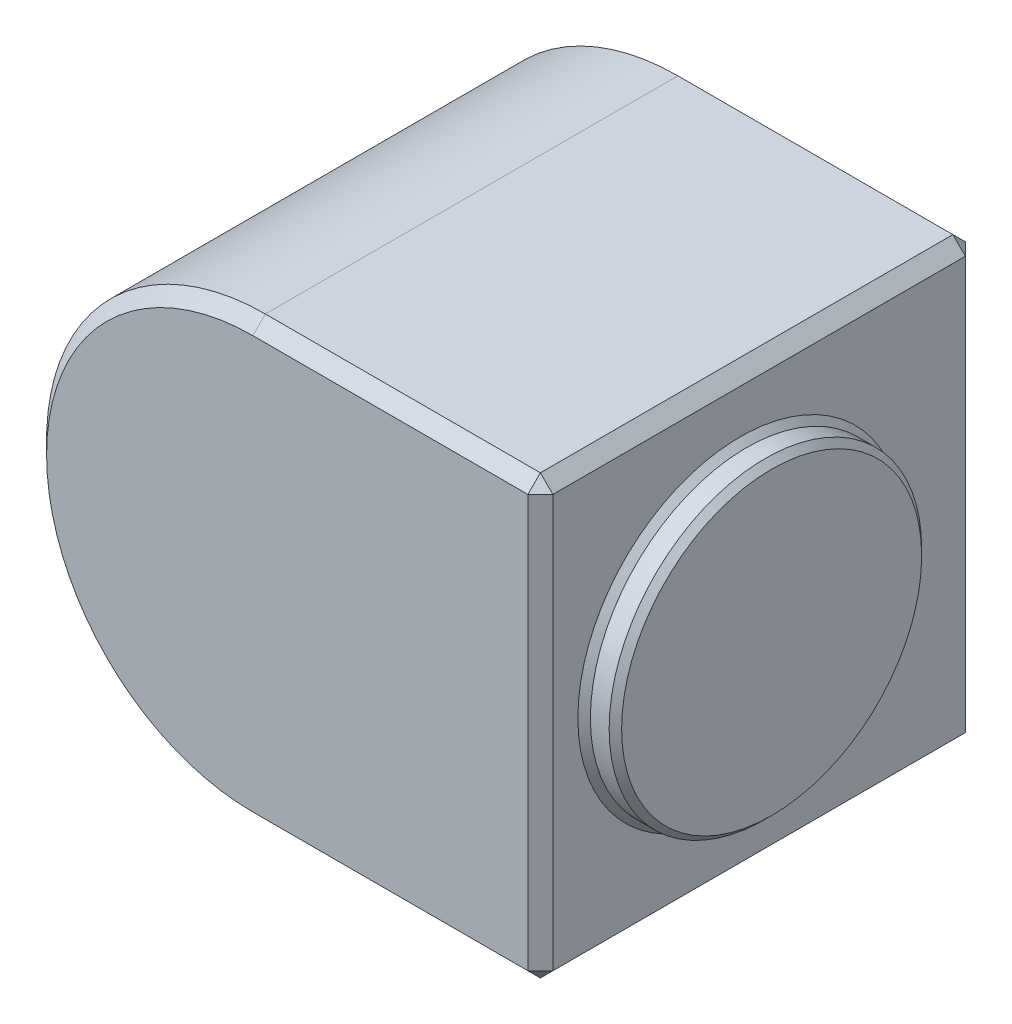
ISO-10303-21;
HEADER;
FILE_DESCRIPTION(('STEP AP214'),'2;1');
FILE_NAME('part.step','',(''),(''),'','','');
FILE_SCHEMA(('AUTOMOTIVE_DESIGN { 1 0 10303 214 1 1 1 1 }'));
ENDSEC;
DATA;
#1=APPLICATION_CONTEXT('core data for automotive mechanical design processes');
#2=APPLICATION_PROTOCOL_DEFINITION('international standard','automotive_design',2000,#1);
#3=PRODUCT_CONTEXT('',#1,'mechanical');
#4=PRODUCT('Part','Part','',(#3));
#5=PRODUCT_RELATED_PRODUCT_CATEGORY('part','',(#4));
#6=PRODUCT_DEFINITION_FORMATION('','',#4);
#7=PRODUCT_DEFINITION_CONTEXT('part definition',#1,'design');
#8=PRODUCT_DEFINITION('design','',#6,#7);
#9=PRODUCT_DEFINITION_SHAPE('','',#8);
#10=(LENGTH_UNIT() NAMED_UNIT(*) SI_UNIT(.MILLI.,.METRE.));
#11=(NAMED_UNIT(*) PLANE_ANGLE_UNIT() SI_UNIT($,.RADIAN.));
#12=(NAMED_UNIT(*) SI_UNIT($,.STERADIAN.) SOLID_ANGLE_UNIT());
#13=UNCERTAINTY_MEASURE_WITH_UNIT(LENGTH_MEASURE(1.E-05),#10,'distance_accuracy_value','');
#14=(GEOMETRIC_REPRESENTATION_CONTEXT(3) GLOBAL_UNCERTAINTY_ASSIGNED_CONTEXT((#13)) GLOBAL_UNIT_ASSIGNED_CONTEXT((#10,
#11,#12)) REPRESENTATION_CONTEXT('',''));
#15=CARTESIAN_POINT('',(0.,0.,0.));
#16=DIRECTION('',(0.,0.,1.));
#17=DIRECTION('',(1.,0.,0.));
#18=AXIS2_PLACEMENT_3D('',#15,#16,#17);
#19=CARTESIAN_POINT('',(0.,0.,70.));
#20=DIRECTION('',(0.,0.,-1.));
#21=DIRECTION('',(-1.,0.,0.));
#22=AXIS2_PLACEMENT_3D('',#19,#20,#21);
#23=CYLINDRICAL_SURFACE('',#22,35.);
#24=DIRECTION('',(0.,0.,-1.));
#25=VECTOR('',#24,1.);
#26=CARTESIAN_POINT('',(0.,35.,70.));
#27=LINE('',#26,#25);
#28=CARTESIAN_POINT('',(0.,35.,68.));
#29=VERTEX_POINT('',#28);
#30=CARTESIAN_POINT('',(0.,35.,2.));
#31=VERTEX_POINT('',#30);
#32=EDGE_CURVE('E129',#29,#31,#27,.T.);
#33=ORIENTED_EDGE('',*,*,#32,.T.);
#34=CARTESIAN_POINT('',(0.,0.,2.));
#35=DIRECTION('',(0.,0.,1.));
#36=DIRECTION('',(1.,0.,0.));
#37=AXIS2_PLACEMENT_3D('',#34,#35,#36);
#38=CIRCLE('',#37,35.);
#39=CARTESIAN_POINT('',(0.,-35.,2.));
#40=VERTEX_POINT('',#39);
#41=EDGE_CURVE('E128',#31,#40,#38,.T.);
#42=ORIENTED_EDGE('',*,*,#41,.T.);
#43=DIRECTION('',(0.,0.,-1.));
#44=VECTOR('',#43,1.);
#45=CARTESIAN_POINT('',(0.,-35.,70.));
#46=LINE('',#45,#44);
#47=CARTESIAN_POINT('',(0.,-35.,68.));
#48=VERTEX_POINT('',#47);
#49=EDGE_CURVE('E113',#48,#40,#46,.T.);
#50=ORIENTED_EDGE('',*,*,#49,.F.);
#51=CARTESIAN_POINT('',(0.,0.,68.));
#52=DIRECTION('',(0.,0.,1.));
#53=DIRECTION('',(1.,0.,0.));
#54=AXIS2_PLACEMENT_3D('',#51,#52,#53);
#55=CIRCLE('',#54,35.);
#56=EDGE_CURVE('E126',#48,#29,#55,.F.);
#57=ORIENTED_EDGE('',*,*,#56,.T.);
#58=EDGE_LOOP('',(#33,#42,#50,#57));
#59=FACE_BOUND('',#58,.T.);
#60=ADVANCED_FACE('F32',(#59),#23,.T.);
#61=CARTESIAN_POINT('',(46.,-35.,70.));
#62=DIRECTION('',(0.,1.,0.));
#63=DIRECTION('',(-1.,0.,0.));
#64=AXIS2_PLACEMENT_3D('',#61,#62,#63);
#65=PLANE('',#64);
#66=ORIENTED_EDGE('',*,*,#49,.T.);
#67=DIRECTION('',(1.,0.,0.));
#68=VECTOR('',#67,1.);
#69=CARTESIAN_POINT('',(46.,-35.,2.));
#70=LINE('',#69,#68);
#71=CARTESIAN_POINT('',(44.,-35.,2.));
#72=VERTEX_POINT('',#71);
#73=EDGE_CURVE('E121',#40,#72,#70,.T.);
#74=ORIENTED_EDGE('',*,*,#73,.T.);
#75=DIRECTION('',(0.,0.,1.));
#76=VECTOR('',#75,1.);
#77=CARTESIAN_POINT('',(44.,-35.,70.));
#78=LINE('',#77,#76);
#79=CARTESIAN_POINT('',(44.,-35.,68.));
#80=VERTEX_POINT('',#79);
#81=EDGE_CURVE('E116',#72,#80,#78,.T.);
#82=ORIENTED_EDGE('',*,*,#81,.T.);
#83=DIRECTION('',(-1.,0.,0.));
#84=VECTOR('',#83,1.);
#85=CARTESIAN_POINT('',(0.,-35.,68.));
#86=LINE('',#85,#84);
#87=EDGE_CURVE('E109',#80,#48,#86,.T.);
#88=ORIENTED_EDGE('',*,*,#87,.T.);
#89=EDGE_LOOP('',(#66,#74,#82,#88));
#90=FACE_BOUND('',#89,.T.);
#91=ADVANCED_FACE('F111',(#90),#65,.F.);
#92=CARTESIAN_POINT('',(46.,35.,70.));
#93=DIRECTION('',(-1.,0.,0.));
#94=DIRECTION('',(0.,0.,1.));
#95=AXIS2_PLACEMENT_3D('',#92,#93,#94);
#96=PLANE('',#95);
#97=CARTESIAN_POINT('',(46.,0.,38.));
#98=DIRECTION('',(-1.,0.,0.));
#99=DIRECTION('',(0.,0.,1.));
#100=AXIS2_PLACEMENT_3D('',#97,#98,#99);
#101=CIRCLE('',#100,26.);
#102=CARTESIAN_POINT('',(46.,0.,64.));
#103=VERTEX_POINT('',#102);
#104=EDGE_CURVE('E40',#103,#103,#101,.T.);
#105=ORIENTED_EDGE('',*,*,#104,.T.);
#106=EDGE_LOOP('',(#105));
#107=FACE_BOUND('',#106,.T.);
#108=DIRECTION('',(0.,-1.,0.));
#109=VECTOR('',#108,1.);
#110=CARTESIAN_POINT('',(46.,-35.,68.));
#111=LINE('',#110,#109);
#112=CARTESIAN_POINT('',(46.,33.,68.));
#113=VERTEX_POINT('',#112);
#114=CARTESIAN_POINT('',(46.,-33.,68.));
#115=VERTEX_POINT('',#114);
#116=EDGE_CURVE('E443',#113,#115,#111,.T.);
#117=ORIENTED_EDGE('',*,*,#116,.T.);
#118=DIRECTION('',(0.,0.,-1.));
#119=VECTOR('',#118,1.);
#120=CARTESIAN_POINT('',(46.,-33.,70.));
#121=LINE('',#120,#119);
#122=CARTESIAN_POINT('',(46.,-33.,1.99999999999999));
#123=VERTEX_POINT('',#122);
#124=EDGE_CURVE('E449',#115,#123,#121,.T.);
#125=ORIENTED_EDGE('',*,*,#124,.T.);
#126=DIRECTION('',(0.,1.,0.));
#127=VECTOR('',#126,1.);
#128=CARTESIAN_POINT('',(46.,35.,1.99999999999999));
#129=LINE('',#128,#127);
#130=CARTESIAN_POINT('',(46.,33.,1.99999999999999));
#131=VERTEX_POINT('',#130);
#132=EDGE_CURVE('E447',#123,#131,#129,.T.);
#133=ORIENTED_EDGE('',*,*,#132,.T.);
#134=DIRECTION('',(0.,0.,1.));
#135=VECTOR('',#134,1.);
#136=CARTESIAN_POINT('',(46.,33.,70.));
#137=LINE('',#136,#135);
#138=EDGE_CURVE('E445',#131,#113,#137,.T.);
#139=ORIENTED_EDGE('',*,*,#138,.T.);
#140=EDGE_LOOP('',(#117,#125,#133,#139));
#141=FACE_BOUND('',#140,.T.);
#142=ADVANCED_FACE('F176',(#107,#141),#96,.F.);
#143=CARTESIAN_POINT('',(0.,35.,70.));
#144=DIRECTION('',(0.,-1.,0.));
#145=DIRECTION('',(1.,0.,0.));
#146=AXIS2_PLACEMENT_3D('',#143,#144,#145);
#147=PLANE('',#146);
#148=DIRECTION('',(0.,0.,-1.));
#149=VECTOR('',#148,1.);
#150=CARTESIAN_POINT('',(44.,35.,70.));
#151=LINE('',#150,#149);
#152=CARTESIAN_POINT('',(44.,35.,68.));
#153=VERTEX_POINT('',#152);
#154=CARTESIAN_POINT('',(44.,35.,2.));
#155=VERTEX_POINT('',#154);
#156=EDGE_CURVE('E47',#153,#155,#151,.T.);
#157=ORIENTED_EDGE('',*,*,#156,.T.);
#158=DIRECTION('',(-1.,0.,0.));
#159=VECTOR('',#158,1.);
#160=CARTESIAN_POINT('',(0.,35.,2.));
#161=LINE('',#160,#159);
#162=EDGE_CURVE('E159',#155,#31,#161,.T.);
#163=ORIENTED_EDGE('',*,*,#162,.T.);
#164=ORIENTED_EDGE('',*,*,#32,.F.);
#165=DIRECTION('',(1.,0.,0.));
#166=VECTOR('',#165,1.);
#167=CARTESIAN_POINT('',(46.,35.,68.));
#168=LINE('',#167,#166);
#169=EDGE_CURVE('E52',#29,#153,#168,.T.);
#170=ORIENTED_EDGE('',*,*,#169,.T.);
#171=EDGE_LOOP('',(#157,#163,#164,#170));
#172=FACE_BOUND('',#171,.T.);
#173=ADVANCED_FACE('F405',(#172),#147,.F.);
#174=CARTESIAN_POINT('',(0.,0.,70.));
#175=DIRECTION('',(0.,0.,1.));
#176=DIRECTION('',(1.,0.,0.));
#177=AXIS2_PLACEMENT_3D('',#174,#175,#176);
#178=PLANE('',#177);
#179=CARTESIAN_POINT('',(0.,0.,70.));
#180=DIRECTION('',(0.,0.,1.));
#181=DIRECTION('',(1.,0.,0.));
#182=AXIS2_PLACEMENT_3D('',#179,#180,#181);
#183=CIRCLE('',#182,33.);
#184=CARTESIAN_POINT('',(0.,33.,70.));
#185=VERTEX_POINT('',#184);
#186=CARTESIAN_POINT('',(0.,-33.,70.));
#187=VERTEX_POINT('',#186);
#188=EDGE_CURVE('E433',#185,#187,#183,.T.);
#189=ORIENTED_EDGE('',*,*,#188,.T.);
#190=DIRECTION('',(1.,0.,0.));
#191=VECTOR('',#190,1.);
#192=CARTESIAN_POINT('',(46.,-33.,70.));
#193=LINE('',#192,#191);
#194=CARTESIAN_POINT('',(44.,-33.,70.));
#195=VERTEX_POINT('',#194);
#196=EDGE_CURVE('E140',#187,#195,#193,.T.);
#197=ORIENTED_EDGE('',*,*,#196,.T.);
#198=DIRECTION('',(0.,1.,0.));
#199=VECTOR('',#198,1.);
#200=CARTESIAN_POINT('',(44.,35.,70.));
#201=LINE('',#200,#199);
#202=CARTESIAN_POINT('',(44.,33.,70.));
#203=VERTEX_POINT('',#202);
#204=EDGE_CURVE('E436',#195,#203,#201,.T.);
#205=ORIENTED_EDGE('',*,*,#204,.T.);
#206=DIRECTION('',(-1.,0.,0.));
#207=VECTOR('',#206,1.);
#208=CARTESIAN_POINT('',(0.,33.,70.));
#209=LINE('',#208,#207);
#210=EDGE_CURVE('E435',#203,#185,#209,.T.);
#211=ORIENTED_EDGE('',*,*,#210,.T.);
#212=EDGE_LOOP('',(#189,#197,#205,#211));
#213=FACE_BOUND('',#212,.T.);
#214=ADVANCED_FACE('F198',(#213),#178,.T.);
#215=CARTESIAN_POINT('',(0.,0.,0.));
#216=DIRECTION('',(0.,0.,1.));
#217=DIRECTION('',(1.,0.,0.));
#218=AXIS2_PLACEMENT_3D('',#215,#216,#217);
#219=PLANE('',#218);
#220=CARTESIAN_POINT('',(0.,0.,0.));
#221=DIRECTION('',(0.,0.,1.));
#222=DIRECTION('',(1.,0.,0.));
#223=AXIS2_PLACEMENT_3D('',#220,#221,#222);
#224=CIRCLE('',#223,27.);
#225=CARTESIAN_POINT('',(27.,0.,0.));
#226=VERTEX_POINT('',#225);
#227=EDGE_CURVE('E11',#226,#226,#224,.T.);
#228=ORIENTED_EDGE('',*,*,#227,.T.);
#229=EDGE_LOOP('',(#228));
#230=FACE_BOUND('',#229,.T.);
#231=DIRECTION('',(0.,-1.,0.));
#232=VECTOR('',#231,1.);
#233=CARTESIAN_POINT('',(44.,0.,0.));
#234=LINE('',#233,#232);
#235=CARTESIAN_POINT('',(44.,33.,0.));
#236=VERTEX_POINT('',#235);
#237=CARTESIAN_POINT('',(44.,-33.,0.));
#238=VERTEX_POINT('',#237);
#239=EDGE_CURVE('E496',#236,#238,#234,.T.);
#240=ORIENTED_EDGE('',*,*,#239,.T.);
#241=DIRECTION('',(-1.,0.,0.));
#242=VECTOR('',#241,1.);
#243=CARTESIAN_POINT('',(0.,-33.,0.));
#244=LINE('',#243,#242);
#245=CARTESIAN_POINT('',(0.,-33.,0.));
#246=VERTEX_POINT('',#245);
#247=EDGE_CURVE('E510',#238,#246,#244,.T.);
#248=ORIENTED_EDGE('',*,*,#247,.T.);
#249=CARTESIAN_POINT('',(0.,0.,0.));
#250=DIRECTION('',(0.,0.,1.));
#251=DIRECTION('',(1.,0.,0.));
#252=AXIS2_PLACEMENT_3D('',#249,#250,#251);
#253=CIRCLE('',#252,33.);
#254=CARTESIAN_POINT('',(0.,33.,0.));
#255=VERTEX_POINT('',#254);
#256=EDGE_CURVE('E508',#246,#255,#253,.F.);
#257=ORIENTED_EDGE('',*,*,#256,.T.);
#258=DIRECTION('',(1.,0.,0.));
#259=VECTOR('',#258,1.);
#260=CARTESIAN_POINT('',(0.,33.,0.));
#261=LINE('',#260,#259);
#262=EDGE_CURVE('E505',#255,#236,#261,.T.);
#263=ORIENTED_EDGE('',*,*,#262,.T.);
#264=EDGE_LOOP('',(#240,#248,#257,#263));
#265=FACE_BOUND('',#264,.T.);
#266=ADVANCED_FACE('F188',(#230,#265),#219,.F.);
#267=CARTESIAN_POINT('',(51.,0.,38.));
#268=DIRECTION('',(-1.,0.,0.));
#269=DIRECTION('',(0.,0.,1.));
#270=AXIS2_PLACEMENT_3D('',#267,#268,#269);
#271=CYLINDRICAL_SURFACE('',#270,25.);
#272=CARTESIAN_POINT('',(50.,0.,38.));
#273=DIRECTION('',(1.,0.,0.));
#274=DIRECTION('',(0.,0.,-1.));
#275=AXIS2_PLACEMENT_3D('',#272,#273,#274);
#276=CIRCLE('',#275,25.);
#277=CARTESIAN_POINT('',(50.,0.,13.));
#278=VERTEX_POINT('',#277);
#279=EDGE_CURVE('E171',#278,#278,#276,.F.);
#280=ORIENTED_EDGE('',*,*,#279,.T.);
#281=EDGE_LOOP('',(#280));
#282=FACE_BOUND('',#281,.T.);
#283=CARTESIAN_POINT('',(47.,0.,38.));
#284=DIRECTION('',(-1.,0.,0.));
#285=DIRECTION('',(0.,0.,1.));
#286=AXIS2_PLACEMENT_3D('',#283,#284,#285);
#287=CIRCLE('',#286,25.);
#288=CARTESIAN_POINT('',(47.,0.,63.));
#289=VERTEX_POINT('',#288);
#290=EDGE_CURVE('E168',#289,#289,#287,.F.);
#291=ORIENTED_EDGE('',*,*,#290,.T.);
#292=EDGE_LOOP('',(#291));
#293=FACE_BOUND('',#292,.T.);
#294=ADVANCED_FACE('F185',(#282,#293),#271,.T.);
#295=CARTESIAN_POINT('',(51.,0.,38.));
#296=DIRECTION('',(1.,0.,0.));
#297=DIRECTION('',(0.,0.,-1.));
#298=AXIS2_PLACEMENT_3D('',#295,#296,#297);
#299=PLANE('',#298);
#300=CARTESIAN_POINT('',(51.,0.,38.));
#301=DIRECTION('',(1.,0.,0.));
#302=DIRECTION('',(0.,0.,-1.));
#303=AXIS2_PLACEMENT_3D('',#300,#301,#302);
#304=CIRCLE('',#303,24.);
#305=CARTESIAN_POINT('',(51.,0.,14.));
#306=VERTEX_POINT('',#305);
#307=EDGE_CURVE('E165',#306,#306,#304,.T.);
#308=ORIENTED_EDGE('',*,*,#307,.T.);
#309=EDGE_LOOP('',(#308));
#310=FACE_BOUND('',#309,.T.);
#311=ADVANCED_FACE('F187',(#310),#299,.T.);
#312=CARTESIAN_POINT('',(0.,33.,70.));
#313=DIRECTION('',(0.,0.70710678118655,0.707106781186545));
#314=DIRECTION('',(1.,0.,0.));
#315=AXIS2_PLACEMENT_3D('',#312,#313,#314);
#316=PLANE('',#315);
#317=DIRECTION('',(0.,-0.707106781186545,0.70710678118655));
#318=VECTOR('',#317,1.);
#319=CARTESIAN_POINT('',(44.,34.,69.));
#320=LINE('',#319,#318);
#321=EDGE_CURVE('E144',#153,#203,#320,.T.);
#322=ORIENTED_EDGE('',*,*,#321,.F.);
#323=ORIENTED_EDGE('',*,*,#169,.F.);
#324=DIRECTION('',(0.,0.707106781186545,-0.70710678118655));
#325=VECTOR('',#324,1.);
#326=CARTESIAN_POINT('',(0.,33.,70.));
#327=LINE('',#326,#325);
#328=EDGE_CURVE('E139',#185,#29,#327,.T.);
#329=ORIENTED_EDGE('',*,*,#328,.F.);
#330=ORIENTED_EDGE('',*,*,#210,.F.);
#331=EDGE_LOOP('',(#322,#323,#329,#330));
#332=FACE_BOUND('',#331,.T.);
#333=ADVANCED_FACE('F195',(#332),#316,.T.);
#334=CARTESIAN_POINT('',(0.,0.,70.));
#335=DIRECTION('',(0.,0.,-1.));
#336=DIRECTION('',(-1.,0.,0.));
#337=AXIS2_PLACEMENT_3D('',#334,#335,#336);
#338=CONICAL_SURFACE('',#337,33.,0.785398163397445);
#339=ORIENTED_EDGE('',*,*,#328,.T.);
#340=ORIENTED_EDGE('',*,*,#56,.F.);
#341=DIRECTION('',(0.,-0.707106781186545,-0.70710678118655));
#342=VECTOR('',#341,1.);
#343=CARTESIAN_POINT('',(0.,-33.,70.));
#344=LINE('',#343,#342);
#345=EDGE_CURVE('E136',#187,#48,#344,.T.);
#346=ORIENTED_EDGE('',*,*,#345,.F.);
#347=ORIENTED_EDGE('',*,*,#188,.F.);
#348=EDGE_LOOP('',(#339,#340,#346,#347));
#349=FACE_BOUND('',#348,.T.);
#350=ADVANCED_FACE('F134',(#349),#338,.T.);
#351=CARTESIAN_POINT('',(46.,33.,68.));
#352=DIRECTION('',(0.577350269189626,0.57735026918963,0.577350269189622));
#353=DIRECTION('',(-0.70710678118655,0.707106781186545,0.));
#354=AXIS2_PLACEMENT_3D('',#351,#352,#353);
#355=PLANE('',#354);
#356=DIRECTION('',(0.70710678118655,-0.707106781186545,0.));
#357=VECTOR('',#356,1.);
#358=CARTESIAN_POINT('',(46.,33.,68.));
#359=LINE('',#358,#357);
#360=EDGE_CURVE('E150',#153,#113,#359,.T.);
#361=ORIENTED_EDGE('',*,*,#360,.F.);
#362=ORIENTED_EDGE('',*,*,#321,.T.);
#363=DIRECTION('',(0.707106781186545,0.,-0.70710678118655));
#364=VECTOR('',#363,1.);
#365=CARTESIAN_POINT('',(46.,33.,68.));
#366=LINE('',#365,#364);
#367=EDGE_CURVE('E145',#113,#203,#366,.F.);
#368=ORIENTED_EDGE('',*,*,#367,.F.);
#369=EDGE_LOOP('',(#361,#362,#368));
#370=FACE_BOUND('',#369,.T.);
#371=ADVANCED_FACE('F253',(#370),#355,.T.);
#372=CARTESIAN_POINT('',(0.,-33.,70.));
#373=DIRECTION('',(0.,-0.70710678118655,0.707106781186545));
#374=DIRECTION('',(-1.,0.,0.));
#375=AXIS2_PLACEMENT_3D('',#372,#373,#374);
#376=PLANE('',#375);
#377=ORIENTED_EDGE('',*,*,#345,.T.);
#378=ORIENTED_EDGE('',*,*,#87,.F.);
#379=DIRECTION('',(0.,-0.707106781186545,-0.70710678118655));
#380=VECTOR('',#379,1.);
#381=CARTESIAN_POINT('',(44.,-33.,70.));
#382=LINE('',#381,#380);
#383=EDGE_CURVE('E481',#195,#80,#382,.T.);
#384=ORIENTED_EDGE('',*,*,#383,.F.);
#385=ORIENTED_EDGE('',*,*,#196,.F.);
#386=EDGE_LOOP('',(#377,#378,#384,#385));
#387=FACE_BOUND('',#386,.T.);
#388=ADVANCED_FACE('F142',(#387),#376,.T.);
#389=CARTESIAN_POINT('',(44.,0.,70.));
#390=DIRECTION('',(0.70710678118655,0.,0.707106781186545));
#391=DIRECTION('',(0.,-1.,0.));
#392=AXIS2_PLACEMENT_3D('',#389,#390,#391);
#393=PLANE('',#392);
#394=ORIENTED_EDGE('',*,*,#367,.T.);
#395=ORIENTED_EDGE('',*,*,#204,.F.);
#396=DIRECTION('',(-0.707106781186545,0.,0.70710678118655));
#397=VECTOR('',#396,1.);
#398=CARTESIAN_POINT('',(44.,-33.,70.));
#399=LINE('',#398,#397);
#400=EDGE_CURVE('E479',#115,#195,#399,.T.);
#401=ORIENTED_EDGE('',*,*,#400,.F.);
#402=ORIENTED_EDGE('',*,*,#116,.F.);
#403=EDGE_LOOP('',(#394,#395,#401,#402));
#404=FACE_BOUND('',#403,.T.);
#405=ADVANCED_FACE('F246',(#404),#393,.T.);
#406=CARTESIAN_POINT('',(44.,35.,70.));
#407=DIRECTION('',(-0.707106781186545,-0.70710678118655,0.));
#408=DIRECTION('',(0.,0.,-1.));
#409=AXIS2_PLACEMENT_3D('',#406,#407,#408);
#410=PLANE('',#409);
#411=ORIENTED_EDGE('',*,*,#360,.T.);
#412=ORIENTED_EDGE('',*,*,#138,.F.);
#413=DIRECTION('',(-0.70710678118655,0.707106781186545,0.));
#414=VECTOR('',#413,1.);
#415=CARTESIAN_POINT('',(46.,33.,1.99999999999999));
#416=LINE('',#415,#414);
#417=EDGE_CURVE('E476',#155,#131,#416,.F.);
#418=ORIENTED_EDGE('',*,*,#417,.F.);
#419=ORIENTED_EDGE('',*,*,#156,.F.);
#420=EDGE_LOOP('',(#411,#412,#418,#419));
#421=FACE_BOUND('',#420,.T.);
#422=ADVANCED_FACE('F242',(#421),#410,.F.);
#423=CARTESIAN_POINT('',(44.,-33.,70.));
#424=DIRECTION('',(0.577350269189626,-0.57735026918963,0.577350269189622));
#425=DIRECTION('',(0.70710678118655,0.707106781186545,0.));
#426=AXIS2_PLACEMENT_3D('',#423,#424,#425);
#427=PLANE('',#426);
#428=ORIENTED_EDGE('',*,*,#400,.T.);
#429=ORIENTED_EDGE('',*,*,#383,.T.);
#430=DIRECTION('',(-0.70710678118655,-0.707106781186545,0.));
#431=VECTOR('',#430,1.);
#432=CARTESIAN_POINT('',(45.,-34.,68.));
#433=LINE('',#432,#431);
#434=EDGE_CURVE('E470',#115,#80,#433,.T.);
#435=ORIENTED_EDGE('',*,*,#434,.F.);
#436=EDGE_LOOP('',(#428,#429,#435));
#437=FACE_BOUND('',#436,.T.);
#438=ADVANCED_FACE('F238',(#437),#427,.T.);
#439=CARTESIAN_POINT('',(46.,33.,1.99999999999999));
#440=DIRECTION('',(0.577350269189622,0.57735026918963,-0.577350269189626));
#441=DIRECTION('',(0.,0.707106781186545,0.70710678118655));
#442=AXIS2_PLACEMENT_3D('',#439,#440,#441);
#443=PLANE('',#442);
#444=DIRECTION('',(0.70710678118655,0.,0.707106781186545));
#445=VECTOR('',#444,1.);
#446=CARTESIAN_POINT('',(46.,33.,1.99999999999999));
#447=LINE('',#446,#445);
#448=EDGE_CURVE('E467',#236,#131,#447,.T.);
#449=ORIENTED_EDGE('',*,*,#448,.F.);
#450=DIRECTION('',(0.,-0.707106781186545,-0.70710678118655));
#451=VECTOR('',#450,1.);
#452=CARTESIAN_POINT('',(44.,34.,1.));
#453=LINE('',#452,#451);
#454=EDGE_CURVE('E473',#155,#236,#453,.T.);
#455=ORIENTED_EDGE('',*,*,#454,.F.);
#456=ORIENTED_EDGE('',*,*,#417,.T.);
#457=EDGE_LOOP('',(#449,#455,#456));
#458=FACE_BOUND('',#457,.T.);
#459=ADVANCED_FACE('F234',(#458),#443,.T.);
#460=CARTESIAN_POINT('',(0.,35.,2.));
#461=DIRECTION('',(0.,-0.70710678118655,0.707106781186545));
#462=DIRECTION('',(-1.,0.,0.));
#463=AXIS2_PLACEMENT_3D('',#460,#461,#462);
#464=PLANE('',#463);
#465=ORIENTED_EDGE('',*,*,#454,.T.);
#466=ORIENTED_EDGE('',*,*,#262,.F.);
#467=DIRECTION('',(0.,-0.707106781186545,-0.70710678118655));
#468=VECTOR('',#467,1.);
#469=CARTESIAN_POINT('',(0.,35.,2.));
#470=LINE('',#469,#468);
#471=EDGE_CURVE('E464',#31,#255,#470,.T.);
#472=ORIENTED_EDGE('',*,*,#471,.F.);
#473=ORIENTED_EDGE('',*,*,#162,.F.);
#474=EDGE_LOOP('',(#465,#466,#472,#473));
#475=FACE_BOUND('',#474,.T.);
#476=ADVANCED_FACE('F230',(#475),#464,.F.);
#477=CARTESIAN_POINT('',(46.,-33.,70.));
#478=DIRECTION('',(-0.707106781186545,0.70710678118655,0.));
#479=DIRECTION('',(0.,0.,-1.));
#480=AXIS2_PLACEMENT_3D('',#477,#478,#479);
#481=PLANE('',#480);
#482=ORIENTED_EDGE('',*,*,#434,.T.);
#483=ORIENTED_EDGE('',*,*,#81,.F.);
#484=DIRECTION('',(0.70710678118655,0.707106781186545,0.));
#485=VECTOR('',#484,1.);
#486=CARTESIAN_POINT('',(44.,-35.,2.));
#487=LINE('',#486,#485);
#488=EDGE_CURVE('E461',#123,#72,#487,.F.);
#489=ORIENTED_EDGE('',*,*,#488,.F.);
#490=ORIENTED_EDGE('',*,*,#124,.F.);
#491=EDGE_LOOP('',(#482,#483,#489,#490));
#492=FACE_BOUND('',#491,.T.);
#493=ADVANCED_FACE('F226',(#492),#481,.F.);
#494=CARTESIAN_POINT('',(46.,35.,1.99999999999999));
#495=DIRECTION('',(-0.707106781186545,0.,0.70710678118655));
#496=DIRECTION('',(0.,1.,0.));
#497=AXIS2_PLACEMENT_3D('',#494,#495,#496);
#498=PLANE('',#497);
#499=ORIENTED_EDGE('',*,*,#448,.T.);
#500=ORIENTED_EDGE('',*,*,#132,.F.);
#501=DIRECTION('',(-0.70710678118655,0.,-0.707106781186545));
#502=VECTOR('',#501,1.);
#503=CARTESIAN_POINT('',(45.,-33.,0.999999999999994));
#504=LINE('',#503,#502);
#505=EDGE_CURVE('E459',#238,#123,#504,.F.);
#506=ORIENTED_EDGE('',*,*,#505,.F.);
#507=ORIENTED_EDGE('',*,*,#239,.F.);
#508=EDGE_LOOP('',(#499,#500,#506,#507));
#509=FACE_BOUND('',#508,.T.);
#510=ADVANCED_FACE('F222',(#509),#498,.F.);
#511=CARTESIAN_POINT('',(0.,0.,2.));
#512=DIRECTION('',(0.,0.,1.));
#513=DIRECTION('',(1.,0.,0.));
#514=AXIS2_PLACEMENT_3D('',#511,#512,#513);
#515=CONICAL_SURFACE('',#514,35.,0.785398163397445);
#516=ORIENTED_EDGE('',*,*,#471,.T.);
#517=ORIENTED_EDGE('',*,*,#256,.F.);
#518=DIRECTION('',(0.,0.707106781186545,-0.70710678118655));
#519=VECTOR('',#518,1.);
#520=CARTESIAN_POINT('',(0.,-35.,2.));
#521=LINE('',#520,#519);
#522=EDGE_CURVE('E457',#40,#246,#521,.T.);
#523=ORIENTED_EDGE('',*,*,#522,.F.);
#524=ORIENTED_EDGE('',*,*,#41,.F.);
#525=EDGE_LOOP('',(#516,#517,#523,#524));
#526=FACE_BOUND('',#525,.T.);
#527=ADVANCED_FACE('F218',(#526),#515,.T.);
#528=CARTESIAN_POINT('',(44.,-35.,2.));
#529=DIRECTION('',(0.577350269189622,-0.57735026918963,-0.577350269189626));
#530=DIRECTION('',(0.,0.707106781186545,-0.70710678118655));
#531=AXIS2_PLACEMENT_3D('',#528,#529,#530);
#532=PLANE('',#531);
#533=ORIENTED_EDGE('',*,*,#505,.T.);
#534=ORIENTED_EDGE('',*,*,#488,.T.);
#535=DIRECTION('',(0.,-0.707106781186545,0.70710678118655));
#536=VECTOR('',#535,1.);
#537=CARTESIAN_POINT('',(44.,-35.,2.));
#538=LINE('',#537,#536);
#539=EDGE_CURVE('E455',#238,#72,#538,.T.);
#540=ORIENTED_EDGE('',*,*,#539,.F.);
#541=EDGE_LOOP('',(#533,#534,#540));
#542=FACE_BOUND('',#541,.T.);
#543=ADVANCED_FACE('F214',(#542),#532,.T.);
#544=CARTESIAN_POINT('',(46.,-35.,2.));
#545=DIRECTION('',(0.,0.70710678118655,0.707106781186545));
#546=DIRECTION('',(1.,0.,0.));
#547=AXIS2_PLACEMENT_3D('',#544,#545,#546);
#548=PLANE('',#547);
#549=ORIENTED_EDGE('',*,*,#522,.T.);
#550=ORIENTED_EDGE('',*,*,#247,.F.);
#551=ORIENTED_EDGE('',*,*,#539,.T.);
#552=ORIENTED_EDGE('',*,*,#73,.F.);
#553=EDGE_LOOP('',(#549,#550,#551,#552));
#554=FACE_BOUND('',#553,.T.);
#555=ADVANCED_FACE('F210',(#554),#548,.F.);
#556=CARTESIAN_POINT('',(0.,0.,5.));
#557=DIRECTION('',(0.,0.,-1.));
#558=DIRECTION('',(-1.,0.,0.));
#559=AXIS2_PLACEMENT_3D('',#556,#557,#558);
#560=CYLINDRICAL_SURFACE('',#559,26.);
#561=CARTESIAN_POINT('',(0.,0.,4.));
#562=DIRECTION('',(0.,0.,-1.));
#563=DIRECTION('',(-1.,0.,0.));
#564=AXIS2_PLACEMENT_3D('',#561,#562,#563);
#565=CIRCLE('',#564,26.);
#566=CARTESIAN_POINT('',(-26.,0.,4.));
#567=VERTEX_POINT('',#566);
#568=EDGE_CURVE('E162',#567,#567,#565,.F.);
#569=ORIENTED_EDGE('',*,*,#568,.T.);
#570=EDGE_LOOP('',(#569));
#571=FACE_BOUND('',#570,.T.);
#572=CARTESIAN_POINT('',(0.,0.,1.00000000000001));
#573=DIRECTION('',(0.,0.,1.));
#574=DIRECTION('',(1.,0.,0.));
#575=AXIS2_PLACEMENT_3D('',#572,#573,#574);
#576=CIRCLE('',#575,26.);
#577=CARTESIAN_POINT('',(26.,0.,1.00000000000001));
#578=VERTEX_POINT('',#577);
#579=EDGE_CURVE('E158',#578,#578,#576,.F.);
#580=ORIENTED_EDGE('',*,*,#579,.T.);
#581=EDGE_LOOP('',(#580));
#582=FACE_BOUND('',#581,.T.);
#583=ADVANCED_FACE('F213',(#571,#582),#560,.F.);
#584=CARTESIAN_POINT('',(0.,0.,5.));
#585=DIRECTION('',(0.,0.,-1.));
#586=DIRECTION('',(-1.,0.,0.));
#587=AXIS2_PLACEMENT_3D('',#584,#585,#586);
#588=PLANE('',#587);
#589=CARTESIAN_POINT('',(0.,0.,5.));
#590=DIRECTION('',(0.,0.,-1.));
#591=DIRECTION('',(-1.,0.,0.));
#592=AXIS2_PLACEMENT_3D('',#589,#590,#591);
#593=CIRCLE('',#592,25.);
#594=CARTESIAN_POINT('',(-25.,0.,5.));
#595=VERTEX_POINT('',#594);
#596=EDGE_CURVE('E155',#595,#595,#593,.T.);
#597=ORIENTED_EDGE('',*,*,#596,.T.);
#598=EDGE_LOOP('',(#597));
#599=FACE_BOUND('',#598,.T.);
#600=ADVANCED_FACE('F265',(#599),#588,.T.);
#601=CARTESIAN_POINT('',(0.,0.,5.));
#602=DIRECTION('',(0.,0.,-1.));
#603=DIRECTION('',(-1.,0.,0.));
#604=AXIS2_PLACEMENT_3D('',#601,#602,#603);
#605=CONICAL_SURFACE('',#604,25.,0.78539816339745);
#606=ORIENTED_EDGE('',*,*,#568,.F.);
#607=EDGE_LOOP('',(#606));
#608=FACE_BOUND('',#607,.T.);
#609=ORIENTED_EDGE('',*,*,#596,.F.);
#610=EDGE_LOOP('',(#609));
#611=FACE_BOUND('',#610,.T.);
#612=ADVANCED_FACE('F262',(#608,#611),#605,.F.);
#613=CARTESIAN_POINT('',(51.,0.,38.));
#614=DIRECTION('',(-1.,0.,0.));
#615=DIRECTION('',(0.,0.,1.));
#616=AXIS2_PLACEMENT_3D('',#613,#614,#615);
#617=CONICAL_SURFACE('',#616,24.,0.785398163397459);
#618=ORIENTED_EDGE('',*,*,#279,.F.);
#619=EDGE_LOOP('',(#618));
#620=FACE_BOUND('',#619,.T.);
#621=ORIENTED_EDGE('',*,*,#307,.F.);
#622=EDGE_LOOP('',(#621));
#623=FACE_BOUND('',#622,.T.);
#624=ADVANCED_FACE('F182',(#620,#623),#617,.T.);
#625=CARTESIAN_POINT('',(47.,0.,38.));
#626=DIRECTION('',(-1.,0.,0.));
#627=DIRECTION('',(0.,0.,1.));
#628=AXIS2_PLACEMENT_3D('',#625,#626,#627);
#629=CONICAL_SURFACE('',#628,25.,0.785398163397431);
#630=ORIENTED_EDGE('',*,*,#104,.F.);
#631=EDGE_LOOP('',(#630));
#632=FACE_BOUND('',#631,.T.);
#633=ORIENTED_EDGE('',*,*,#290,.F.);
#634=EDGE_LOOP('',(#633));
#635=FACE_BOUND('',#634,.T.);
#636=ADVANCED_FACE('F179',(#632,#635),#629,.T.);
#637=CARTESIAN_POINT('',(0.,0.,1.00000000000001));
#638=DIRECTION('',(0.,0.,-1.));
#639=DIRECTION('',(-1.,0.,0.));
#640=AXIS2_PLACEMENT_3D('',#637,#638,#639);
#641=CONICAL_SURFACE('',#640,26.,0.785398163397447);
#642=ORIENTED_EDGE('',*,*,#227,.F.);
#643=EDGE_LOOP('',(#642));
#644=FACE_BOUND('',#643,.T.);
#645=ORIENTED_EDGE('',*,*,#579,.F.);
#646=EDGE_LOOP('',(#645));
#647=FACE_BOUND('',#646,.T.);
#648=ADVANCED_FACE('F34',(#644,#647),#641,.F.);
#649=CLOSED_SHELL('',(#60,#91,#142,#173,#214,#266,#294,#311,#333,#350,#371,#388,#405,#422,#438,
#459,#476,#493,#510,#527,#543,#555,#583,#600,#612,#624,#636,#648));
#650=MANIFOLD_SOLID_BREP('B2',#649);
#651=ADVANCED_BREP_SHAPE_REPRESENTATION('',(#18,#650),#14);
#652=SHAPE_DEFINITION_REPRESENTATION(#9,#651);
ENDSEC;
END-ISO-10303-21;
